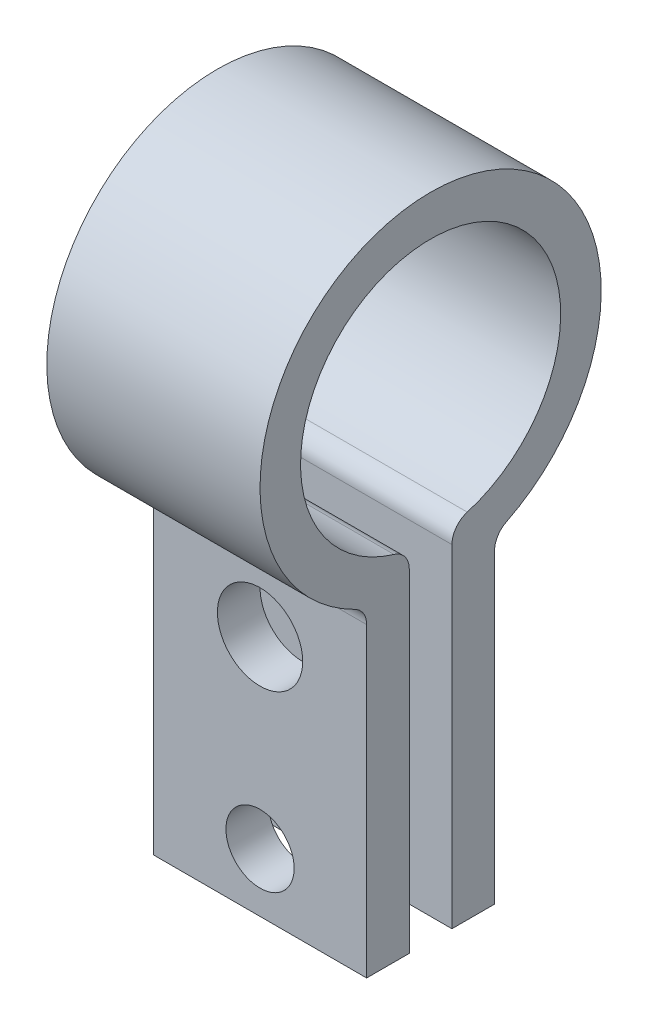
ISO-10303-21;
HEADER;
FILE_DESCRIPTION(('STEP AP214'),'2;1');
FILE_NAME('part.step','',(''),(''),'','','');
FILE_SCHEMA(('AUTOMOTIVE_DESIGN { 1 0 10303 214 1 1 1 1 }'));
ENDSEC;
DATA;
#1=APPLICATION_CONTEXT('core data for automotive mechanical design processes');
#2=APPLICATION_PROTOCOL_DEFINITION('international standard','automotive_design',2000,#1);
#3=PRODUCT_CONTEXT('',#1,'mechanical');
#4=PRODUCT('Part','Part','',(#3));
#5=PRODUCT_RELATED_PRODUCT_CATEGORY('part','',(#4));
#6=PRODUCT_DEFINITION_FORMATION('','',#4);
#7=PRODUCT_DEFINITION_CONTEXT('part definition',#1,'design');
#8=PRODUCT_DEFINITION('design','',#6,#7);
#9=PRODUCT_DEFINITION_SHAPE('','',#8);
#10=(LENGTH_UNIT() NAMED_UNIT(*) SI_UNIT(.MILLI.,.METRE.));
#11=(NAMED_UNIT(*) PLANE_ANGLE_UNIT() SI_UNIT($,.RADIAN.));
#12=(NAMED_UNIT(*) SI_UNIT($,.STERADIAN.) SOLID_ANGLE_UNIT());
#13=UNCERTAINTY_MEASURE_WITH_UNIT(LENGTH_MEASURE(1.E-05),#10,'distance_accuracy_value','');
#14=(GEOMETRIC_REPRESENTATION_CONTEXT(3) GLOBAL_UNCERTAINTY_ASSIGNED_CONTEXT((#13)) GLOBAL_UNIT_ASSIGNED_CONTEXT((#10,
#11,#12)) REPRESENTATION_CONTEXT('',''));
#15=CARTESIAN_POINT('',(0.,0.,0.));
#16=DIRECTION('',(0.,0.,1.));
#17=DIRECTION('',(1.,0.,0.));
#18=AXIS2_PLACEMENT_3D('',#15,#16,#17);
#19=CARTESIAN_POINT('',(5.,0.,0.));
#20=DIRECTION('',(-1.,0.,0.));
#21=DIRECTION('',(0.,0.,1.));
#22=AXIS2_PLACEMENT_3D('',#19,#20,#21);
#23=CYLINDRICAL_SURFACE('',#22,6.1);
#24=CARTESIAN_POINT('',(5.,0.,0.));
#25=DIRECTION('',(-1.,0.,0.));
#26=DIRECTION('',(0.,0.,1.));
#27=AXIS2_PLACEMENT_3D('',#24,#25,#26);
#28=CIRCLE('',#27,6.1);
#29=CARTESIAN_POINT('',(5.,-5.85298310504404,1.71830985915493));
#30=VERTEX_POINT('',#29);
#31=CARTESIAN_POINT('',(5.,-5.85298310504404,-1.71830985915493));
#32=VERTEX_POINT('',#31);
#33=EDGE_CURVE('E143',#30,#32,#28,.T.);
#34=ORIENTED_EDGE('',*,*,#33,.F.);
#35=DIRECTION('',(-1.,0.,0.));
#36=VECTOR('',#35,1.);
#37=CARTESIAN_POINT('',(5.,-5.85298310504404,1.71830985915493));
#38=LINE('',#37,#36);
#39=CARTESIAN_POINT('',(-5.,-5.85298310504404,1.71830985915493));
#40=VERTEX_POINT('',#39);
#41=EDGE_CURVE('E232',#30,#40,#38,.T.);
#42=ORIENTED_EDGE('',*,*,#41,.T.);
#43=CARTESIAN_POINT('',(-5.,0.,0.));
#44=DIRECTION('',(-1.,0.,0.));
#45=DIRECTION('',(0.,0.,1.));
#46=AXIS2_PLACEMENT_3D('',#43,#44,#45);
#47=CIRCLE('',#46,6.1);
#48=CARTESIAN_POINT('',(-5.,-5.85298310504404,-1.71830985915493));
#49=VERTEX_POINT('',#48);
#50=EDGE_CURVE('E180',#40,#49,#47,.T.);
#51=ORIENTED_EDGE('',*,*,#50,.T.);
#52=DIRECTION('',(-1.,0.,0.));
#53=VECTOR('',#52,1.);
#54=CARTESIAN_POINT('',(5.,-5.85298310504404,-1.71830985915493));
#55=LINE('',#54,#53);
#56=EDGE_CURVE('E229',#49,#32,#55,.F.);
#57=ORIENTED_EDGE('',*,*,#56,.T.);
#58=EDGE_LOOP('',(#34,#42,#51,#57));
#59=FACE_BOUND('',#58,.T.);
#60=ADVANCED_FACE('F41',(#59),#23,.F.);
#61=CARTESIAN_POINT('',(5.,-22.4161984870957,-1.));
#62=DIRECTION('',(0.,0.,-1.));
#63=DIRECTION('',(-1.,0.,0.));
#64=AXIS2_PLACEMENT_3D('',#61,#62,#63);
#65=PLANE('',#64);
#66=CARTESIAN_POINT('',(0.,-19.6661984870957,-1.));
#67=DIRECTION('',(0.,0.,-1.));
#68=DIRECTION('',(-1.,0.,0.));
#69=AXIS2_PLACEMENT_3D('',#66,#67,#68);
#70=CIRCLE('',#69,1.6);
#71=CARTESIAN_POINT('',(-1.6,-19.6661984870957,-1.));
#72=VERTEX_POINT('',#71);
#73=EDGE_CURVE('E184',#72,#72,#70,.T.);
#74=ORIENTED_EDGE('',*,*,#73,.T.);
#75=EDGE_LOOP('',(#74));
#76=FACE_BOUND('',#75,.T.);
#77=CARTESIAN_POINT('',(0.,-11.0622577482986,-1.));
#78=DIRECTION('',(0.,0.,-1.));
#79=DIRECTION('',(-1.,0.,0.));
#80=AXIS2_PLACEMENT_3D('',#77,#78,#79);
#81=CIRCLE('',#80,2.);
#82=CARTESIAN_POINT('',(-2.,-11.0622577482986,-1.));
#83=VERTEX_POINT('',#82);
#84=EDGE_CURVE('E269',#83,#83,#81,.T.);
#85=ORIENTED_EDGE('',*,*,#84,.T.);
#86=EDGE_LOOP('',(#85));
#87=FACE_BOUND('',#86,.T.);
#88=DIRECTION('',(0.,-1.,0.));
#89=VECTOR('',#88,1.);
#90=CARTESIAN_POINT('',(5.,-22.4161984870957,-1.));
#91=LINE('',#90,#89);
#92=CARTESIAN_POINT('',(5.,-6.81248853210044,-1.));
#93=VERTEX_POINT('',#92);
#94=CARTESIAN_POINT('',(5.,-22.4161984870957,-1.));
#95=VERTEX_POINT('',#94);
#96=EDGE_CURVE('E132',#93,#95,#91,.T.);
#97=ORIENTED_EDGE('',*,*,#96,.F.);
#98=DIRECTION('',(-1.,0.,0.));
#99=VECTOR('',#98,1.);
#100=CARTESIAN_POINT('',(5.,-6.81248853210044,-1.));
#101=LINE('',#100,#99);
#102=CARTESIAN_POINT('',(-5.,-6.81248853210044,-1.));
#103=VERTEX_POINT('',#102);
#104=EDGE_CURVE('E249',#93,#103,#101,.T.);
#105=ORIENTED_EDGE('',*,*,#104,.T.);
#106=DIRECTION('',(0.,-1.,0.));
#107=VECTOR('',#106,1.);
#108=CARTESIAN_POINT('',(-5.,-22.4161984870957,-1.));
#109=LINE('',#108,#107);
#110=CARTESIAN_POINT('',(-5.,-22.4161984870957,-1.));
#111=VERTEX_POINT('',#110);
#112=EDGE_CURVE('E149',#103,#111,#109,.T.);
#113=ORIENTED_EDGE('',*,*,#112,.T.);
#114=DIRECTION('',(-1.,0.,0.));
#115=VECTOR('',#114,1.);
#116=CARTESIAN_POINT('',(5.,-22.4161984870957,-1.));
#117=LINE('',#116,#115);
#118=EDGE_CURVE('E146',#95,#111,#117,.T.);
#119=ORIENTED_EDGE('',*,*,#118,.F.);
#120=EDGE_LOOP('',(#97,#105,#113,#119));
#121=FACE_BOUND('',#120,.T.);
#122=ADVANCED_FACE('F147',(#76,#87,#121),#65,.F.);
#123=CARTESIAN_POINT('',(5.,-22.4161984870957,-3.));
#124=DIRECTION('',(0.,1.,0.));
#125=DIRECTION('',(0.,0.,1.));
#126=AXIS2_PLACEMENT_3D('',#123,#124,#125);
#127=PLANE('',#126);
#128=DIRECTION('',(0.,0.,-1.));
#129=VECTOR('',#128,1.);
#130=CARTESIAN_POINT('',(-5.,-22.4161984870957,-3.));
#131=LINE('',#130,#129);
#132=CARTESIAN_POINT('',(-5.,-22.4161984870957,-3.));
#133=VERTEX_POINT('',#132);
#134=EDGE_CURVE('E187',#111,#133,#131,.T.);
#135=ORIENTED_EDGE('',*,*,#134,.T.);
#136=DIRECTION('',(-1.,0.,0.));
#137=VECTOR('',#136,1.);
#138=CARTESIAN_POINT('',(5.,-22.4161984870957,-3.));
#139=LINE('',#138,#137);
#140=CARTESIAN_POINT('',(5.,-22.4161984870957,-3.));
#141=VERTEX_POINT('',#140);
#142=EDGE_CURVE('E154',#141,#133,#139,.T.);
#143=ORIENTED_EDGE('',*,*,#142,.F.);
#144=DIRECTION('',(0.,0.,-1.));
#145=VECTOR('',#144,1.);
#146=CARTESIAN_POINT('',(5.,-22.4161984870957,-3.));
#147=LINE('',#146,#145);
#148=EDGE_CURVE('E137',#95,#141,#147,.T.);
#149=ORIENTED_EDGE('',*,*,#148,.F.);
#150=ORIENTED_EDGE('',*,*,#118,.T.);
#151=EDGE_LOOP('',(#135,#143,#149,#150));
#152=FACE_BOUND('',#151,.T.);
#153=ADVANCED_FACE('F156',(#152),#127,.F.);
#154=CARTESIAN_POINT('',(5.,-7.41619848709566,-3.));
#155=DIRECTION('',(0.,0.,1.));
#156=DIRECTION('',(0.,-1.,0.));
#157=AXIS2_PLACEMENT_3D('',#154,#155,#156);
#158=PLANE('',#157);
#159=CARTESIAN_POINT('',(0.,-19.6661984870957,-3.));
#160=DIRECTION('',(0.,0.,1.));
#161=DIRECTION('',(0.,-1.,0.));
#162=AXIS2_PLACEMENT_3D('',#159,#160,#161);
#163=CIRCLE('',#162,1.6);
#164=CARTESIAN_POINT('',(0.,-21.2661984870957,-3.));
#165=VERTEX_POINT('',#164);
#166=EDGE_CURVE('E283',#165,#165,#163,.T.);
#167=ORIENTED_EDGE('',*,*,#166,.T.);
#168=EDGE_LOOP('',(#167));
#169=FACE_BOUND('',#168,.T.);
#170=CARTESIAN_POINT('',(0.,-11.0622577482986,-3.));
#171=DIRECTION('',(0.,0.,1.));
#172=DIRECTION('',(0.,-1.,0.));
#173=AXIS2_PLACEMENT_3D('',#170,#171,#172);
#174=CIRCLE('',#173,2.);
#175=CARTESIAN_POINT('',(0.,-13.0622577482986,-3.));
#176=VERTEX_POINT('',#175);
#177=EDGE_CURVE('E262',#176,#176,#174,.T.);
#178=ORIENTED_EDGE('',*,*,#177,.T.);
#179=EDGE_LOOP('',(#178));
#180=FACE_BOUND('',#179,.T.);
#181=DIRECTION('',(0.,1.,0.));
#182=VECTOR('',#181,1.);
#183=CARTESIAN_POINT('',(-5.,-7.41619848709566,-3.));
#184=LINE('',#183,#182);
#185=CARTESIAN_POINT('',(-5.,-8.06225774829855,-3.));
#186=VERTEX_POINT('',#185);
#187=EDGE_CURVE('E190',#133,#186,#184,.T.);
#188=ORIENTED_EDGE('',*,*,#187,.T.);
#189=DIRECTION('',(1.,0.,0.));
#190=VECTOR('',#189,1.);
#191=CARTESIAN_POINT('',(5.,-8.06225774829855,-3.));
#192=LINE('',#191,#190);
#193=CARTESIAN_POINT('',(5.,-8.06225774829855,-3.));
#194=VERTEX_POINT('',#193);
#195=EDGE_CURVE('E226',#186,#194,#192,.T.);
#196=ORIENTED_EDGE('',*,*,#195,.T.);
#197=DIRECTION('',(0.,1.,0.));
#198=VECTOR('',#197,1.);
#199=CARTESIAN_POINT('',(5.,-7.41619848709566,-3.));
#200=LINE('',#199,#198);
#201=EDGE_CURVE('E160',#141,#194,#200,.T.);
#202=ORIENTED_EDGE('',*,*,#201,.F.);
#203=ORIENTED_EDGE('',*,*,#142,.T.);
#204=EDGE_LOOP('',(#188,#196,#202,#203));
#205=FACE_BOUND('',#204,.T.);
#206=ADVANCED_FACE('F301',(#169,#180,#205),#158,.F.);
#207=CARTESIAN_POINT('',(5.,0.,0.));
#208=DIRECTION('',(-1.,0.,0.));
#209=DIRECTION('',(0.,0.,1.));
#210=AXIS2_PLACEMENT_3D('',#207,#208,#209);
#211=CYLINDRICAL_SURFACE('',#210,8.);
#212=CARTESIAN_POINT('',(-5.,0.,0.));
#213=DIRECTION('',(1.,0.,0.));
#214=DIRECTION('',(0.,0.,1.));
#215=AXIS2_PLACEMENT_3D('',#212,#213,#214);
#216=CIRCLE('',#215,8.);
#217=CARTESIAN_POINT('',(-5.,-7.16645133182093,-3.55555555555556));
#218=VERTEX_POINT('',#217);
#219=CARTESIAN_POINT('',(-5.,-7.16645133182093,3.55555555555556));
#220=VERTEX_POINT('',#219);
#221=EDGE_CURVE('E194',#218,#220,#216,.T.);
#222=ORIENTED_EDGE('',*,*,#221,.T.);
#223=DIRECTION('',(-1.,0.,0.));
#224=VECTOR('',#223,1.);
#225=CARTESIAN_POINT('',(5.,-7.16645133182093,3.55555555555556));
#226=LINE('',#225,#224);
#227=CARTESIAN_POINT('',(5.,-7.16645133182093,3.55555555555556));
#228=VERTEX_POINT('',#227);
#229=EDGE_CURVE('E223',#220,#228,#226,.F.);
#230=ORIENTED_EDGE('',*,*,#229,.T.);
#231=CARTESIAN_POINT('',(5.,0.,0.));
#232=DIRECTION('',(1.,0.,0.));
#233=DIRECTION('',(0.,0.,1.));
#234=AXIS2_PLACEMENT_3D('',#231,#232,#233);
#235=CIRCLE('',#234,8.);
#236=CARTESIAN_POINT('',(5.,-7.16645133182093,-3.55555555555556));
#237=VERTEX_POINT('',#236);
#238=EDGE_CURVE('E163',#237,#228,#235,.T.);
#239=ORIENTED_EDGE('',*,*,#238,.F.);
#240=DIRECTION('',(-1.,0.,0.));
#241=VECTOR('',#240,1.);
#242=CARTESIAN_POINT('',(5.,-7.16645133182093,-3.55555555555556));
#243=LINE('',#242,#241);
#244=EDGE_CURVE('E219',#237,#218,#243,.T.);
#245=ORIENTED_EDGE('',*,*,#244,.T.);
#246=EDGE_LOOP('',(#222,#230,#239,#245));
#247=FACE_BOUND('',#246,.T.);
#248=ADVANCED_FACE('F310',(#247),#211,.T.);
#249=CARTESIAN_POINT('',(5.,-7.41619848709566,3.));
#250=DIRECTION('',(0.,0.,-1.));
#251=DIRECTION('',(0.,1.,0.));
#252=AXIS2_PLACEMENT_3D('',#249,#250,#251);
#253=PLANE('',#252);
#254=CARTESIAN_POINT('',(0.,-19.6661984870957,3.));
#255=DIRECTION('',(0.,0.,1.));
#256=DIRECTION('',(1.,0.,0.));
#257=AXIS2_PLACEMENT_3D('',#254,#255,#256);
#258=CIRCLE('',#257,1.6);
#259=CARTESIAN_POINT('',(1.6,-19.6661984870957,3.));
#260=VERTEX_POINT('',#259);
#261=EDGE_CURVE('E263',#260,#260,#258,.T.);
#262=ORIENTED_EDGE('',*,*,#261,.F.);
#263=EDGE_LOOP('',(#262));
#264=FACE_BOUND('',#263,.T.);
#265=CARTESIAN_POINT('',(0.,-11.0622577482986,3.));
#266=DIRECTION('',(0.,0.,1.));
#267=DIRECTION('',(1.,0.,0.));
#268=AXIS2_PLACEMENT_3D('',#265,#266,#267);
#269=CIRCLE('',#268,2.);
#270=CARTESIAN_POINT('',(2.,-11.0622577482986,3.));
#271=VERTEX_POINT('',#270);
#272=EDGE_CURVE('E272',#271,#271,#269,.T.);
#273=ORIENTED_EDGE('',*,*,#272,.F.);
#274=EDGE_LOOP('',(#273));
#275=FACE_BOUND('',#274,.T.);
#276=DIRECTION('',(0.,-1.,0.));
#277=VECTOR('',#276,1.);
#278=CARTESIAN_POINT('',(5.,-7.41619848709566,3.));
#279=LINE('',#278,#277);
#280=CARTESIAN_POINT('',(5.,-8.06225774829855,3.));
#281=VERTEX_POINT('',#280);
#282=CARTESIAN_POINT('',(5.,-22.4161984870957,3.));
#283=VERTEX_POINT('',#282);
#284=EDGE_CURVE('E170',#281,#283,#279,.T.);
#285=ORIENTED_EDGE('',*,*,#284,.F.);
#286=DIRECTION('',(1.,0.,0.));
#287=VECTOR('',#286,1.);
#288=CARTESIAN_POINT('',(-5.,-8.06225774829855,3.));
#289=LINE('',#288,#287);
#290=CARTESIAN_POINT('',(-5.,-8.06225774829855,3.));
#291=VERTEX_POINT('',#290);
#292=EDGE_CURVE('E153',#281,#291,#289,.F.);
#293=ORIENTED_EDGE('',*,*,#292,.T.);
#294=DIRECTION('',(0.,-1.,0.));
#295=VECTOR('',#294,1.);
#296=CARTESIAN_POINT('',(-5.,-7.41619848709566,3.));
#297=LINE('',#296,#295);
#298=CARTESIAN_POINT('',(-5.,-22.4161984870957,3.));
#299=VERTEX_POINT('',#298);
#300=EDGE_CURVE('E198',#291,#299,#297,.T.);
#301=ORIENTED_EDGE('',*,*,#300,.T.);
#302=DIRECTION('',(-1.,0.,0.));
#303=VECTOR('',#302,1.);
#304=CARTESIAN_POINT('',(5.,-22.4161984870957,3.));
#305=LINE('',#304,#303);
#306=EDGE_CURVE('E210',#283,#299,#305,.T.);
#307=ORIENTED_EDGE('',*,*,#306,.F.);
#308=EDGE_LOOP('',(#285,#293,#301,#307));
#309=FACE_BOUND('',#308,.T.);
#310=ADVANCED_FACE('F320',(#264,#275,#309),#253,.F.);
#311=CARTESIAN_POINT('',(5.,-22.4161984870957,3.));
#312=DIRECTION('',(0.,1.,0.));
#313=DIRECTION('',(0.,0.,1.));
#314=AXIS2_PLACEMENT_3D('',#311,#312,#313);
#315=PLANE('',#314);
#316=DIRECTION('',(0.,0.,-1.));
#317=VECTOR('',#316,1.);
#318=CARTESIAN_POINT('',(-5.,-22.4161984870957,3.));
#319=LINE('',#318,#317);
#320=CARTESIAN_POINT('',(-5.,-22.4161984870957,1.));
#321=VERTEX_POINT('',#320);
#322=EDGE_CURVE('E201',#299,#321,#319,.T.);
#323=ORIENTED_EDGE('',*,*,#322,.T.);
#324=DIRECTION('',(-1.,0.,0.));
#325=VECTOR('',#324,1.);
#326=CARTESIAN_POINT('',(5.,-22.4161984870957,1.));
#327=LINE('',#326,#325);
#328=CARTESIAN_POINT('',(5.,-22.4161984870957,1.));
#329=VERTEX_POINT('',#328);
#330=EDGE_CURVE('E179',#329,#321,#327,.T.);
#331=ORIENTED_EDGE('',*,*,#330,.F.);
#332=DIRECTION('',(0.,0.,-1.));
#333=VECTOR('',#332,1.);
#334=CARTESIAN_POINT('',(5.,-22.4161984870957,3.));
#335=LINE('',#334,#333);
#336=EDGE_CURVE('E173',#283,#329,#335,.T.);
#337=ORIENTED_EDGE('',*,*,#336,.F.);
#338=ORIENTED_EDGE('',*,*,#306,.T.);
#339=EDGE_LOOP('',(#323,#331,#337,#338));
#340=FACE_BOUND('',#339,.T.);
#341=ADVANCED_FACE('F325',(#340),#315,.F.);
#342=CARTESIAN_POINT('',(5.,-22.4161984870957,1.));
#343=DIRECTION('',(0.,0.,1.));
#344=DIRECTION('',(1.,0.,0.));
#345=AXIS2_PLACEMENT_3D('',#342,#343,#344);
#346=PLANE('',#345);
#347=CARTESIAN_POINT('',(0.,-19.6661984870957,1.));
#348=DIRECTION('',(0.,0.,1.));
#349=DIRECTION('',(1.,0.,0.));
#350=AXIS2_PLACEMENT_3D('',#347,#348,#349);
#351=CIRCLE('',#350,1.6);
#352=CARTESIAN_POINT('',(1.6,-19.6661984870957,1.));
#353=VERTEX_POINT('',#352);
#354=EDGE_CURVE('E45',#353,#353,#351,.T.);
#355=ORIENTED_EDGE('',*,*,#354,.T.);
#356=EDGE_LOOP('',(#355));
#357=FACE_BOUND('',#356,.T.);
#358=CARTESIAN_POINT('',(0.,-11.0622577482986,1.));
#359=DIRECTION('',(0.,0.,1.));
#360=DIRECTION('',(1.,0.,0.));
#361=AXIS2_PLACEMENT_3D('',#358,#359,#360);
#362=CIRCLE('',#361,2.);
#363=CARTESIAN_POINT('',(2.,-11.0622577482986,1.));
#364=VERTEX_POINT('',#363);
#365=EDGE_CURVE('E259',#364,#364,#362,.T.);
#366=ORIENTED_EDGE('',*,*,#365,.T.);
#367=EDGE_LOOP('',(#366));
#368=FACE_BOUND('',#367,.T.);
#369=DIRECTION('',(0.,1.,0.));
#370=VECTOR('',#369,1.);
#371=CARTESIAN_POINT('',(-5.,-22.4161984870957,1.));
#372=LINE('',#371,#370);
#373=CARTESIAN_POINT('',(-5.,-6.81248853210044,1.));
#374=VERTEX_POINT('',#373);
#375=EDGE_CURVE('E204',#321,#374,#372,.T.);
#376=ORIENTED_EDGE('',*,*,#375,.T.);
#377=DIRECTION('',(-1.,0.,0.));
#378=VECTOR('',#377,1.);
#379=CARTESIAN_POINT('',(5.,-6.81248853210044,1.));
#380=LINE('',#379,#378);
#381=CARTESIAN_POINT('',(5.,-6.81248853210044,1.));
#382=VERTEX_POINT('',#381);
#383=EDGE_CURVE('E67',#374,#382,#380,.F.);
#384=ORIENTED_EDGE('',*,*,#383,.T.);
#385=DIRECTION('',(0.,1.,0.));
#386=VECTOR('',#385,1.);
#387=CARTESIAN_POINT('',(5.,-22.4161984870957,1.));
#388=LINE('',#387,#386);
#389=EDGE_CURVE('E176',#329,#382,#388,.T.);
#390=ORIENTED_EDGE('',*,*,#389,.F.);
#391=ORIENTED_EDGE('',*,*,#330,.T.);
#392=EDGE_LOOP('',(#376,#384,#390,#391));
#393=FACE_BOUND('',#392,.T.);
#394=ADVANCED_FACE('F327',(#357,#368,#393),#346,.F.);
#395=CARTESIAN_POINT('',(5.,0.,0.));
#396=DIRECTION('',(-1.,0.,0.));
#397=DIRECTION('',(0.,0.,1.));
#398=AXIS2_PLACEMENT_3D('',#395,#396,#397);
#399=PLANE('',#398);
#400=ORIENTED_EDGE('',*,*,#389,.T.);
#401=CARTESIAN_POINT('',(5.,-6.81248853210044,2.));
#402=DIRECTION('',(-1.,0.,0.));
#403=DIRECTION('',(0.,0.,1.));
#404=AXIS2_PLACEMENT_3D('',#401,#402,#403);
#405=CIRCLE('',#404,1.);
#406=EDGE_CURVE('E246',#382,#30,#405,.F.);
#407=ORIENTED_EDGE('',*,*,#406,.T.);
#408=ORIENTED_EDGE('',*,*,#33,.T.);
#409=CARTESIAN_POINT('',(5.,-6.81248853210044,-2.));
#410=DIRECTION('',(-1.,0.,0.));
#411=DIRECTION('',(0.,0.,1.));
#412=AXIS2_PLACEMENT_3D('',#409,#410,#411);
#413=CIRCLE('',#412,1.);
#414=EDGE_CURVE('E59',#32,#93,#413,.F.);
#415=ORIENTED_EDGE('',*,*,#414,.T.);
#416=ORIENTED_EDGE('',*,*,#96,.T.);
#417=ORIENTED_EDGE('',*,*,#148,.T.);
#418=ORIENTED_EDGE('',*,*,#201,.T.);
#419=CARTESIAN_POINT('',(5.,-8.06225774829855,-4.));
#420=DIRECTION('',(-1.,0.,0.));
#421=DIRECTION('',(0.,0.,1.));
#422=AXIS2_PLACEMENT_3D('',#419,#420,#421);
#423=CIRCLE('',#422,1.);
#424=EDGE_CURVE('E11',#194,#237,#423,.T.);
#425=ORIENTED_EDGE('',*,*,#424,.T.);
#426=ORIENTED_EDGE('',*,*,#238,.T.);
#427=CARTESIAN_POINT('',(5.,-8.06225774829855,4.));
#428=DIRECTION('',(-1.,0.,0.));
#429=DIRECTION('',(0.,0.,1.));
#430=AXIS2_PLACEMENT_3D('',#427,#428,#429);
#431=CIRCLE('',#430,1.);
#432=EDGE_CURVE('E255',#228,#281,#431,.T.);
#433=ORIENTED_EDGE('',*,*,#432,.T.);
#434=ORIENTED_EDGE('',*,*,#284,.T.);
#435=ORIENTED_EDGE('',*,*,#336,.T.);
#436=EDGE_LOOP('',(#400,#407,#408,#415,#416,#417,#418,#425,#426,#433,#434,#435));
#437=FACE_BOUND('',#436,.T.);
#438=ADVANCED_FACE('F134',(#437),#399,.F.);
#439=CARTESIAN_POINT('',(-5.,0.,0.));
#440=DIRECTION('',(-1.,0.,0.));
#441=DIRECTION('',(0.,0.,1.));
#442=AXIS2_PLACEMENT_3D('',#439,#440,#441);
#443=PLANE('',#442);
#444=ORIENTED_EDGE('',*,*,#50,.F.);
#445=CARTESIAN_POINT('',(-5.,-6.81248853210044,2.));
#446=DIRECTION('',(-1.,0.,0.));
#447=DIRECTION('',(0.,0.,1.));
#448=AXIS2_PLACEMENT_3D('',#445,#446,#447);
#449=CIRCLE('',#448,1.);
#450=EDGE_CURVE('E239',#40,#374,#449,.T.);
#451=ORIENTED_EDGE('',*,*,#450,.T.);
#452=ORIENTED_EDGE('',*,*,#375,.F.);
#453=ORIENTED_EDGE('',*,*,#322,.F.);
#454=ORIENTED_EDGE('',*,*,#300,.F.);
#455=CARTESIAN_POINT('',(-5.,-8.06225774829855,4.));
#456=DIRECTION('',(-1.,0.,0.));
#457=DIRECTION('',(0.,0.,1.));
#458=AXIS2_PLACEMENT_3D('',#455,#456,#457);
#459=CIRCLE('',#458,1.);
#460=EDGE_CURVE('E252',#291,#220,#459,.F.);
#461=ORIENTED_EDGE('',*,*,#460,.T.);
#462=ORIENTED_EDGE('',*,*,#221,.F.);
#463=CARTESIAN_POINT('',(-5.,-8.06225774829855,-4.));
#464=DIRECTION('',(-1.,0.,0.));
#465=DIRECTION('',(0.,0.,1.));
#466=AXIS2_PLACEMENT_3D('',#463,#464,#465);
#467=CIRCLE('',#466,1.);
#468=EDGE_CURVE('E51',#218,#186,#467,.F.);
#469=ORIENTED_EDGE('',*,*,#468,.T.);
#470=ORIENTED_EDGE('',*,*,#187,.F.);
#471=ORIENTED_EDGE('',*,*,#134,.F.);
#472=ORIENTED_EDGE('',*,*,#112,.F.);
#473=CARTESIAN_POINT('',(-5.,-6.81248853210044,-2.));
#474=DIRECTION('',(-1.,0.,0.));
#475=DIRECTION('',(0.,0.,1.));
#476=AXIS2_PLACEMENT_3D('',#473,#474,#475);
#477=CIRCLE('',#476,1.);
#478=EDGE_CURVE('E236',#103,#49,#477,.T.);
#479=ORIENTED_EDGE('',*,*,#478,.T.);
#480=EDGE_LOOP('',(#444,#451,#452,#453,#454,#461,#462,#469,#470,#471,#472,#479));
#481=FACE_BOUND('',#480,.T.);
#482=ADVANCED_FACE('F298',(#481),#443,.T.);
#483=CARTESIAN_POINT('',(5.,-8.06225774829855,4.));
#484=DIRECTION('',(-1.,0.,0.));
#485=DIRECTION('',(0.,0.,1.));
#486=AXIS2_PLACEMENT_3D('',#483,#484,#485);
#487=CYLINDRICAL_SURFACE('',#486,1.);
#488=ORIENTED_EDGE('',*,*,#432,.F.);
#489=ORIENTED_EDGE('',*,*,#229,.F.);
#490=ORIENTED_EDGE('',*,*,#460,.F.);
#491=ORIENTED_EDGE('',*,*,#292,.F.);
#492=EDGE_LOOP('',(#488,#489,#490,#491));
#493=FACE_BOUND('',#492,.T.);
#494=ADVANCED_FACE('F317',(#493),#487,.F.);
#495=CARTESIAN_POINT('',(5.,-8.06225774829855,-4.));
#496=DIRECTION('',(-1.,0.,0.));
#497=DIRECTION('',(0.,0.,1.));
#498=AXIS2_PLACEMENT_3D('',#495,#496,#497);
#499=CYLINDRICAL_SURFACE('',#498,1.);
#500=ORIENTED_EDGE('',*,*,#424,.F.);
#501=ORIENTED_EDGE('',*,*,#195,.F.);
#502=ORIENTED_EDGE('',*,*,#468,.F.);
#503=ORIENTED_EDGE('',*,*,#244,.F.);
#504=EDGE_LOOP('',(#500,#501,#502,#503));
#505=FACE_BOUND('',#504,.T.);
#506=ADVANCED_FACE('F307',(#505),#499,.F.);
#507=CARTESIAN_POINT('',(5.,-6.81248853210044,2.));
#508=DIRECTION('',(-1.,0.,0.));
#509=DIRECTION('',(0.,0.,1.));
#510=AXIS2_PLACEMENT_3D('',#507,#508,#509);
#511=CYLINDRICAL_SURFACE('',#510,1.);
#512=ORIENTED_EDGE('',*,*,#406,.F.);
#513=ORIENTED_EDGE('',*,*,#383,.F.);
#514=ORIENTED_EDGE('',*,*,#450,.F.);
#515=ORIENTED_EDGE('',*,*,#41,.F.);
#516=EDGE_LOOP('',(#512,#513,#514,#515));
#517=FACE_BOUND('',#516,.T.);
#518=ADVANCED_FACE('F351',(#517),#511,.T.);
#519=CARTESIAN_POINT('',(5.,-6.81248853210044,-2.));
#520=DIRECTION('',(-1.,0.,0.));
#521=DIRECTION('',(0.,0.,1.));
#522=AXIS2_PLACEMENT_3D('',#519,#520,#521);
#523=CYLINDRICAL_SURFACE('',#522,1.);
#524=ORIENTED_EDGE('',*,*,#414,.F.);
#525=ORIENTED_EDGE('',*,*,#56,.F.);
#526=ORIENTED_EDGE('',*,*,#478,.F.);
#527=ORIENTED_EDGE('',*,*,#104,.F.);
#528=EDGE_LOOP('',(#524,#525,#526,#527));
#529=FACE_BOUND('',#528,.T.);
#530=ADVANCED_FACE('F43',(#529),#523,.T.);
#531=CARTESIAN_POINT('',(0.,-11.0622577482986,-8.));
#532=DIRECTION('',(0.,0.,1.));
#533=DIRECTION('',(1.,0.,0.));
#534=AXIS2_PLACEMENT_3D('',#531,#532,#533);
#535=CYLINDRICAL_SURFACE('',#534,2.);
#536=ORIENTED_EDGE('',*,*,#272,.T.);
#537=EDGE_LOOP('',(#536));
#538=FACE_BOUND('',#537,.T.);
#539=ORIENTED_EDGE('',*,*,#365,.F.);
#540=EDGE_LOOP('',(#539));
#541=FACE_BOUND('',#540,.T.);
#542=ADVANCED_FACE('F357',(#538,#541),#535,.F.);
#543=CARTESIAN_POINT('',(0.,-19.6661984870957,-8.));
#544=DIRECTION('',(0.,0.,1.));
#545=DIRECTION('',(1.,0.,0.));
#546=AXIS2_PLACEMENT_3D('',#543,#544,#545);
#547=CYLINDRICAL_SURFACE('',#546,1.6);
#548=ORIENTED_EDGE('',*,*,#261,.T.);
#549=EDGE_LOOP('',(#548));
#550=FACE_BOUND('',#549,.T.);
#551=ORIENTED_EDGE('',*,*,#354,.F.);
#552=EDGE_LOOP('',(#551));
#553=FACE_BOUND('',#552,.T.);
#554=ADVANCED_FACE('F361',(#550,#553),#547,.F.);
#555=ORIENTED_EDGE('',*,*,#177,.F.);
#556=EDGE_LOOP('',(#555));
#557=FACE_BOUND('',#556,.T.);
#558=ORIENTED_EDGE('',*,*,#84,.F.);
#559=EDGE_LOOP('',(#558));
#560=FACE_BOUND('',#559,.T.);
#561=ADVANCED_FACE('F364',(#557,#560),#535,.F.);
#562=ORIENTED_EDGE('',*,*,#166,.F.);
#563=EDGE_LOOP('',(#562));
#564=FACE_BOUND('',#563,.T.);
#565=ORIENTED_EDGE('',*,*,#73,.F.);
#566=EDGE_LOOP('',(#565));
#567=FACE_BOUND('',#566,.T.);
#568=ADVANCED_FACE('F369',(#564,#567),#547,.F.);
#569=CLOSED_SHELL('',(#60,#122,#153,#206,#248,#310,#341,#394,#438,#482,#494,#506,#518,#530,#542,
#554,#561,#568));
#570=MANIFOLD_SOLID_BREP('B2',#569);
#571=ADVANCED_BREP_SHAPE_REPRESENTATION('',(#18,#570),#14);
#572=SHAPE_DEFINITION_REPRESENTATION(#9,#571);
ENDSEC;
END-ISO-10303-21;
